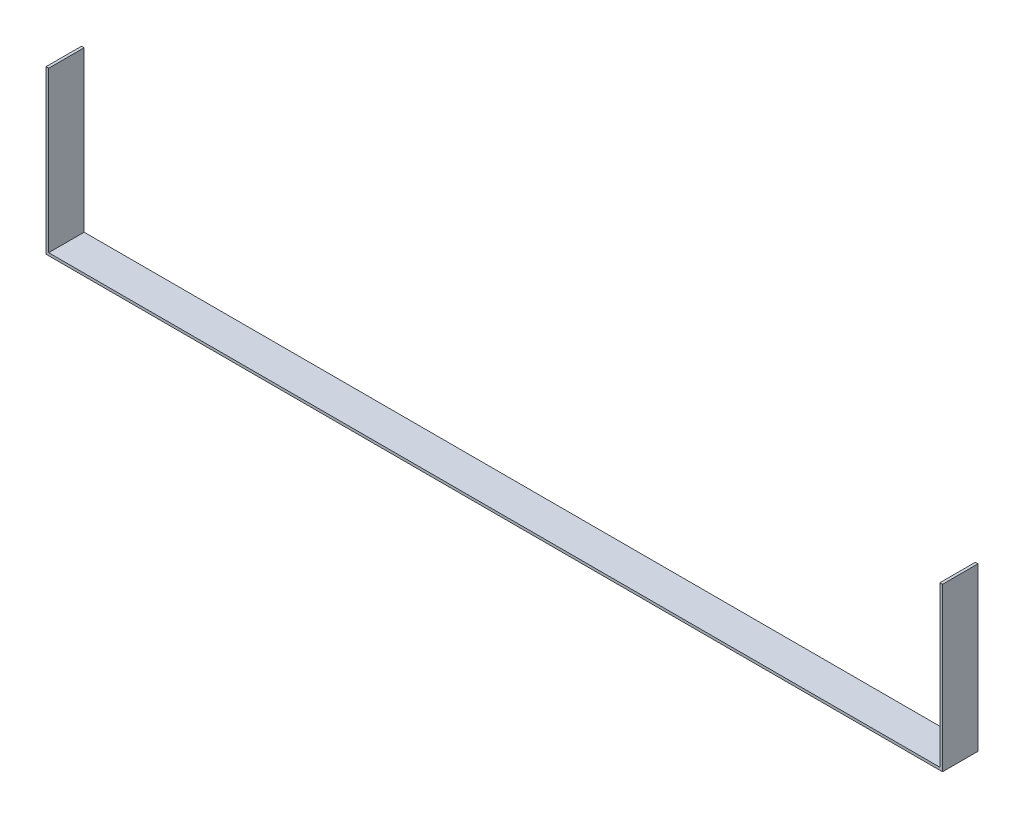
ISO-10303-21;
HEADER;
FILE_DESCRIPTION(('STEP AP214'),'2;1');
FILE_NAME('part.step','',(''),(''),'','','');
FILE_SCHEMA(('AUTOMOTIVE_DESIGN { 1 0 10303 214 1 1 1 1 }'));
ENDSEC;
DATA;
#1=APPLICATION_CONTEXT('core data for automotive mechanical design processes');
#2=APPLICATION_PROTOCOL_DEFINITION('international standard','automotive_design',2000,#1);
#3=PRODUCT_CONTEXT('',#1,'mechanical');
#4=PRODUCT('Part','Part','',(#3));
#5=PRODUCT_RELATED_PRODUCT_CATEGORY('part','',(#4));
#6=PRODUCT_DEFINITION_FORMATION('','',#4);
#7=PRODUCT_DEFINITION_CONTEXT('part definition',#1,'design');
#8=PRODUCT_DEFINITION('design','',#6,#7);
#9=PRODUCT_DEFINITION_SHAPE('','',#8);
#10=(LENGTH_UNIT() NAMED_UNIT(*) SI_UNIT(.MILLI.,.METRE.));
#11=(NAMED_UNIT(*) PLANE_ANGLE_UNIT() SI_UNIT($,.RADIAN.));
#12=(NAMED_UNIT(*) SI_UNIT($,.STERADIAN.) SOLID_ANGLE_UNIT());
#13=UNCERTAINTY_MEASURE_WITH_UNIT(LENGTH_MEASURE(1.E-05),#10,'distance_accuracy_value','');
#14=(GEOMETRIC_REPRESENTATION_CONTEXT(3) GLOBAL_UNCERTAINTY_ASSIGNED_CONTEXT((#13)) GLOBAL_UNIT_ASSIGNED_CONTEXT((#10,
#11,#12)) REPRESENTATION_CONTEXT('',''));
#15=CARTESIAN_POINT('',(0.,0.,0.));
#16=DIRECTION('',(0.,0.,1.));
#17=DIRECTION('',(1.,0.,0.));
#18=AXIS2_PLACEMENT_3D('',#15,#16,#17);
#19=CARTESIAN_POINT('',(-251.,90.,20.));
#20=DIRECTION('',(0.,-1.,0.));
#21=DIRECTION('',(0.,0.,-1.));
#22=AXIS2_PLACEMENT_3D('',#19,#20,#21);
#23=PLANE('',#22);
#24=DIRECTION('',(-1.,0.,0.));
#25=VECTOR('',#24,1.);
#26=CARTESIAN_POINT('',(-251.,90.,0.));
#27=LINE('',#26,#25);
#28=CARTESIAN_POINT('',(-251.,90.,0.));
#29=VERTEX_POINT('',#28);
#30=CARTESIAN_POINT('',(-252.5,90.,0.));
#31=VERTEX_POINT('',#30);
#32=EDGE_CURVE('E129',#29,#31,#27,.T.);
#33=ORIENTED_EDGE('',*,*,#32,.T.);
#34=DIRECTION('',(0.,0.,-1.));
#35=VECTOR('',#34,1.);
#36=CARTESIAN_POINT('',(-252.5,90.,20.));
#37=LINE('',#36,#35);
#38=CARTESIAN_POINT('',(-252.5,90.,20.));
#39=VERTEX_POINT('',#38);
#40=EDGE_CURVE('E11',#39,#31,#37,.T.);
#41=ORIENTED_EDGE('',*,*,#40,.F.);
#42=DIRECTION('',(-1.,0.,0.));
#43=VECTOR('',#42,1.);
#44=CARTESIAN_POINT('',(-251.,90.,20.));
#45=LINE('',#44,#43);
#46=CARTESIAN_POINT('',(-251.,90.,20.));
#47=VERTEX_POINT('',#46);
#48=EDGE_CURVE('E143',#47,#39,#45,.T.);
#49=ORIENTED_EDGE('',*,*,#48,.F.);
#50=DIRECTION('',(0.,0.,-1.));
#51=VECTOR('',#50,1.);
#52=CARTESIAN_POINT('',(-251.,90.,20.));
#53=LINE('',#52,#51);
#54=EDGE_CURVE('E125',#47,#29,#53,.T.);
#55=ORIENTED_EDGE('',*,*,#54,.T.);
#56=EDGE_LOOP('',(#33,#41,#49,#55));
#57=FACE_BOUND('',#56,.T.);
#58=ADVANCED_FACE('F33',(#57),#23,.F.);
#59=CARTESIAN_POINT('',(-252.5,90.,20.));
#60=DIRECTION('',(1.,0.,0.));
#61=DIRECTION('',(0.,0.,-1.));
#62=AXIS2_PLACEMENT_3D('',#59,#60,#61);
#63=PLANE('',#62);
#64=DIRECTION('',(0.,-1.,0.));
#65=VECTOR('',#64,1.);
#66=CARTESIAN_POINT('',(-252.5,90.,0.));
#67=LINE('',#66,#65);
#68=CARTESIAN_POINT('',(-252.5,-1.5,0.));
#69=VERTEX_POINT('',#68);
#70=EDGE_CURVE('E132',#31,#69,#67,.T.);
#71=ORIENTED_EDGE('',*,*,#70,.T.);
#72=DIRECTION('',(0.,0.,-1.));
#73=VECTOR('',#72,1.);
#74=CARTESIAN_POINT('',(-252.5,-1.5,20.));
#75=LINE('',#74,#73);
#76=CARTESIAN_POINT('',(-252.5,-1.5,20.));
#77=VERTEX_POINT('',#76);
#78=EDGE_CURVE('E41',#77,#69,#75,.T.);
#79=ORIENTED_EDGE('',*,*,#78,.F.);
#80=DIRECTION('',(0.,-1.,0.));
#81=VECTOR('',#80,1.);
#82=CARTESIAN_POINT('',(-252.5,90.,20.));
#83=LINE('',#82,#81);
#84=EDGE_CURVE('E92',#39,#77,#83,.T.);
#85=ORIENTED_EDGE('',*,*,#84,.F.);
#86=ORIENTED_EDGE('',*,*,#40,.T.);
#87=EDGE_LOOP('',(#71,#79,#85,#86));
#88=FACE_BOUND('',#87,.T.);
#89=ADVANCED_FACE('F178',(#88),#63,.F.);
#90=CARTESIAN_POINT('',(-252.5,-1.5,20.));
#91=DIRECTION('',(0.,1.,0.));
#92=DIRECTION('',(0.,0.,1.));
#93=AXIS2_PLACEMENT_3D('',#90,#91,#92);
#94=PLANE('',#93);
#95=DIRECTION('',(1.,0.,0.));
#96=VECTOR('',#95,1.);
#97=CARTESIAN_POINT('',(-252.5,-1.5,0.));
#98=LINE('',#97,#96);
#99=CARTESIAN_POINT('',(252.5,-1.5,0.));
#100=VERTEX_POINT('',#99);
#101=EDGE_CURVE('E134',#69,#100,#98,.T.);
#102=ORIENTED_EDGE('',*,*,#101,.T.);
#103=DIRECTION('',(0.,0.,-1.));
#104=VECTOR('',#103,1.);
#105=CARTESIAN_POINT('',(252.5,-1.5,20.));
#106=LINE('',#105,#104);
#107=CARTESIAN_POINT('',(252.5,-1.5,20.));
#108=VERTEX_POINT('',#107);
#109=EDGE_CURVE('E150',#108,#100,#106,.T.);
#110=ORIENTED_EDGE('',*,*,#109,.F.);
#111=DIRECTION('',(1.,0.,0.));
#112=VECTOR('',#111,1.);
#113=CARTESIAN_POINT('',(-252.5,-1.5,20.));
#114=LINE('',#113,#112);
#115=EDGE_CURVE('E158',#77,#108,#114,.T.);
#116=ORIENTED_EDGE('',*,*,#115,.F.);
#117=ORIENTED_EDGE('',*,*,#78,.T.);
#118=EDGE_LOOP('',(#102,#110,#116,#117));
#119=FACE_BOUND('',#118,.T.);
#120=ADVANCED_FACE('F156',(#119),#94,.F.);
#121=CARTESIAN_POINT('',(252.5,-1.5,20.));
#122=DIRECTION('',(-1.,0.,0.));
#123=DIRECTION('',(0.,0.,1.));
#124=AXIS2_PLACEMENT_3D('',#121,#122,#123);
#125=PLANE('',#124);
#126=DIRECTION('',(0.,1.,0.));
#127=VECTOR('',#126,1.);
#128=CARTESIAN_POINT('',(252.5,-1.5,0.));
#129=LINE('',#128,#127);
#130=CARTESIAN_POINT('',(252.5,90.0000000000001,0.));
#131=VERTEX_POINT('',#130);
#132=EDGE_CURVE('E136',#100,#131,#129,.T.);
#133=ORIENTED_EDGE('',*,*,#132,.T.);
#134=DIRECTION('',(0.,0.,-1.));
#135=VECTOR('',#134,1.);
#136=CARTESIAN_POINT('',(252.5,90.0000000000001,20.));
#137=LINE('',#136,#135);
#138=CARTESIAN_POINT('',(252.5,90.0000000000001,20.));
#139=VERTEX_POINT('',#138);
#140=EDGE_CURVE('E147',#139,#131,#137,.T.);
#141=ORIENTED_EDGE('',*,*,#140,.F.);
#142=DIRECTION('',(0.,1.,0.));
#143=VECTOR('',#142,1.);
#144=CARTESIAN_POINT('',(252.5,-1.5,20.));
#145=LINE('',#144,#143);
#146=EDGE_CURVE('E170',#108,#139,#145,.T.);
#147=ORIENTED_EDGE('',*,*,#146,.F.);
#148=ORIENTED_EDGE('',*,*,#109,.T.);
#149=EDGE_LOOP('',(#133,#141,#147,#148));
#150=FACE_BOUND('',#149,.T.);
#151=ADVANCED_FACE('F166',(#150),#125,.F.);
#152=CARTESIAN_POINT('',(251.,90.0000000000001,20.));
#153=DIRECTION('',(0.,-1.,0.));
#154=DIRECTION('',(0.,0.,-1.));
#155=AXIS2_PLACEMENT_3D('',#152,#153,#154);
#156=PLANE('',#155);
#157=DIRECTION('',(-1.,0.,0.));
#158=VECTOR('',#157,1.);
#159=CARTESIAN_POINT('',(251.,90.0000000000001,0.));
#160=LINE('',#159,#158);
#161=CARTESIAN_POINT('',(251.,90.0000000000001,0.));
#162=VERTEX_POINT('',#161);
#163=EDGE_CURVE('E138',#131,#162,#160,.T.);
#164=ORIENTED_EDGE('',*,*,#163,.T.);
#165=DIRECTION('',(0.,0.,-1.));
#166=VECTOR('',#165,1.);
#167=CARTESIAN_POINT('',(251.,90.0000000000001,20.));
#168=LINE('',#167,#166);
#169=CARTESIAN_POINT('',(251.,90.0000000000001,20.));
#170=VERTEX_POINT('',#169);
#171=EDGE_CURVE('E120',#170,#162,#168,.T.);
#172=ORIENTED_EDGE('',*,*,#171,.F.);
#173=DIRECTION('',(-1.,0.,0.));
#174=VECTOR('',#173,1.);
#175=CARTESIAN_POINT('',(251.,90.0000000000001,20.));
#176=LINE('',#175,#174);
#177=EDGE_CURVE('E111',#139,#170,#176,.T.);
#178=ORIENTED_EDGE('',*,*,#177,.F.);
#179=ORIENTED_EDGE('',*,*,#140,.T.);
#180=EDGE_LOOP('',(#164,#172,#178,#179));
#181=FACE_BOUND('',#180,.T.);
#182=ADVANCED_FACE('F169',(#181),#156,.F.);
#183=CARTESIAN_POINT('',(251.,0.,20.));
#184=DIRECTION('',(1.,0.,0.));
#185=DIRECTION('',(0.,0.,-1.));
#186=AXIS2_PLACEMENT_3D('',#183,#184,#185);
#187=PLANE('',#186);
#188=DIRECTION('',(0.,-1.,0.));
#189=VECTOR('',#188,1.);
#190=CARTESIAN_POINT('',(251.,0.,0.));
#191=LINE('',#190,#189);
#192=CARTESIAN_POINT('',(251.,0.,0.));
#193=VERTEX_POINT('',#192);
#194=EDGE_CURVE('E119',#162,#193,#191,.T.);
#195=ORIENTED_EDGE('',*,*,#194,.T.);
#196=DIRECTION('',(0.,0.,-1.));
#197=VECTOR('',#196,1.);
#198=CARTESIAN_POINT('',(251.,0.,20.));
#199=LINE('',#198,#197);
#200=CARTESIAN_POINT('',(251.,0.,20.));
#201=VERTEX_POINT('',#200);
#202=EDGE_CURVE('E116',#201,#193,#199,.T.);
#203=ORIENTED_EDGE('',*,*,#202,.F.);
#204=DIRECTION('',(0.,-1.,0.));
#205=VECTOR('',#204,1.);
#206=CARTESIAN_POINT('',(251.,0.,20.));
#207=LINE('',#206,#205);
#208=EDGE_CURVE('E105',#170,#201,#207,.T.);
#209=ORIENTED_EDGE('',*,*,#208,.F.);
#210=ORIENTED_EDGE('',*,*,#171,.T.);
#211=EDGE_LOOP('',(#195,#203,#209,#210));
#212=FACE_BOUND('',#211,.T.);
#213=ADVANCED_FACE('F117',(#212),#187,.F.);
#214=CARTESIAN_POINT('',(-251.,0.,20.));
#215=DIRECTION('',(0.,-1.,0.));
#216=DIRECTION('',(1.,0.,0.));
#217=AXIS2_PLACEMENT_3D('',#214,#215,#216);
#218=PLANE('',#217);
#219=DIRECTION('',(-1.,0.,0.));
#220=VECTOR('',#219,1.);
#221=CARTESIAN_POINT('',(-251.,0.,0.));
#222=LINE('',#221,#220);
#223=CARTESIAN_POINT('',(-251.,0.,0.));
#224=VERTEX_POINT('',#223);
#225=EDGE_CURVE('E78',#193,#224,#222,.T.);
#226=ORIENTED_EDGE('',*,*,#225,.T.);
#227=DIRECTION('',(0.,0.,-1.));
#228=VECTOR('',#227,1.);
#229=CARTESIAN_POINT('',(-251.,0.,20.));
#230=LINE('',#229,#228);
#231=CARTESIAN_POINT('',(-251.,0.,20.));
#232=VERTEX_POINT('',#231);
#233=EDGE_CURVE('E121',#232,#224,#230,.T.);
#234=ORIENTED_EDGE('',*,*,#233,.F.);
#235=DIRECTION('',(-1.,0.,0.));
#236=VECTOR('',#235,1.);
#237=CARTESIAN_POINT('',(-251.,0.,20.));
#238=LINE('',#237,#236);
#239=EDGE_CURVE('E109',#201,#232,#238,.T.);
#240=ORIENTED_EDGE('',*,*,#239,.F.);
#241=ORIENTED_EDGE('',*,*,#202,.T.);
#242=EDGE_LOOP('',(#226,#234,#240,#241));
#243=FACE_BOUND('',#242,.T.);
#244=ADVANCED_FACE('F123',(#243),#218,.F.);
#245=CARTESIAN_POINT('',(-251.,90.,20.));
#246=DIRECTION('',(-1.,0.,0.));
#247=DIRECTION('',(0.,0.,1.));
#248=AXIS2_PLACEMENT_3D('',#245,#246,#247);
#249=PLANE('',#248);
#250=DIRECTION('',(0.,1.,0.));
#251=VECTOR('',#250,1.);
#252=CARTESIAN_POINT('',(-251.,90.,0.));
#253=LINE('',#252,#251);
#254=EDGE_CURVE('E84',#224,#29,#253,.T.);
#255=ORIENTED_EDGE('',*,*,#254,.T.);
#256=ORIENTED_EDGE('',*,*,#54,.F.);
#257=DIRECTION('',(0.,1.,0.));
#258=VECTOR('',#257,1.);
#259=CARTESIAN_POINT('',(-251.,90.,20.));
#260=LINE('',#259,#258);
#261=EDGE_CURVE('E49',#232,#47,#260,.T.);
#262=ORIENTED_EDGE('',*,*,#261,.F.);
#263=ORIENTED_EDGE('',*,*,#233,.T.);
#264=EDGE_LOOP('',(#255,#256,#262,#263));
#265=FACE_BOUND('',#264,.T.);
#266=ADVANCED_FACE('F194',(#265),#249,.F.);
#267=CARTESIAN_POINT('',(0.,0.,20.));
#268=DIRECTION('',(0.,0.,1.));
#269=DIRECTION('',(1.,0.,0.));
#270=AXIS2_PLACEMENT_3D('',#267,#268,#269);
#271=PLANE('',#270);
#272=ORIENTED_EDGE('',*,*,#48,.T.);
#273=ORIENTED_EDGE('',*,*,#84,.T.);
#274=ORIENTED_EDGE('',*,*,#115,.T.);
#275=ORIENTED_EDGE('',*,*,#146,.T.);
#276=ORIENTED_EDGE('',*,*,#177,.T.);
#277=ORIENTED_EDGE('',*,*,#208,.T.);
#278=ORIENTED_EDGE('',*,*,#239,.T.);
#279=ORIENTED_EDGE('',*,*,#261,.T.);
#280=EDGE_LOOP('',(#272,#273,#274,#275,#276,#277,#278,#279));
#281=FACE_BOUND('',#280,.T.);
#282=ADVANCED_FACE('F107',(#281),#271,.T.);
#283=CARTESIAN_POINT('',(0.,0.,0.));
#284=DIRECTION('',(0.,0.,1.));
#285=DIRECTION('',(1.,0.,0.));
#286=AXIS2_PLACEMENT_3D('',#283,#284,#285);
#287=PLANE('',#286);
#288=ORIENTED_EDGE('',*,*,#32,.F.);
#289=ORIENTED_EDGE('',*,*,#254,.F.);
#290=ORIENTED_EDGE('',*,*,#225,.F.);
#291=ORIENTED_EDGE('',*,*,#194,.F.);
#292=ORIENTED_EDGE('',*,*,#163,.F.);
#293=ORIENTED_EDGE('',*,*,#132,.F.);
#294=ORIENTED_EDGE('',*,*,#101,.F.);
#295=ORIENTED_EDGE('',*,*,#70,.F.);
#296=EDGE_LOOP('',(#288,#289,#290,#291,#292,#293,#294,#295));
#297=FACE_BOUND('',#296,.T.);
#298=ADVANCED_FACE('F162',(#297),#287,.F.);
#299=CLOSED_SHELL('',(#58,#89,#120,#151,#182,#213,#244,#266,#282,#298));
#300=MANIFOLD_SOLID_BREP('B2',#299);
#301=ADVANCED_BREP_SHAPE_REPRESENTATION('',(#18,#300),#14);
#302=SHAPE_DEFINITION_REPRESENTATION(#9,#301);
ENDSEC;
END-ISO-10303-21;
